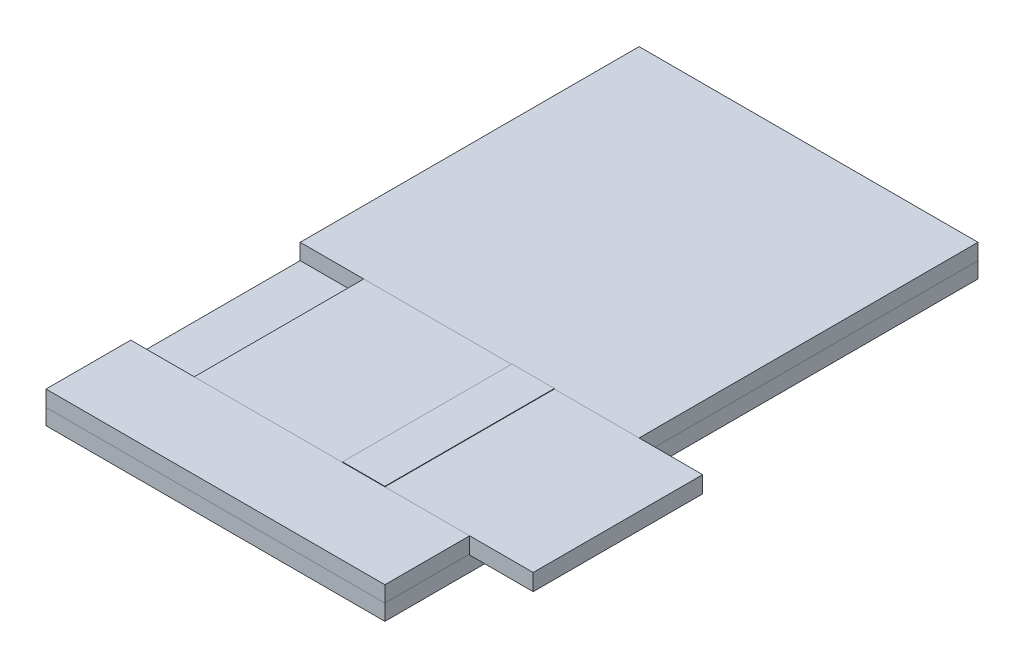
ISO-10303-21;
HEADER;
FILE_DESCRIPTION(('STEP AP214'),'2;1');
FILE_NAME('part.step','',(''),(''),'','','');
FILE_SCHEMA(('AUTOMOTIVE_DESIGN { 1 0 10303 214 1 1 1 1 }'));
ENDSEC;
DATA;
#1=APPLICATION_CONTEXT('core data for automotive mechanical design processes');
#2=APPLICATION_PROTOCOL_DEFINITION('international standard','automotive_design',2000,#1);
#3=PRODUCT_CONTEXT('',#1,'mechanical');
#4=PRODUCT('Part','Part','',(#3));
#5=PRODUCT_RELATED_PRODUCT_CATEGORY('part','',(#4));
#6=PRODUCT_DEFINITION_FORMATION('','',#4);
#7=PRODUCT_DEFINITION_CONTEXT('part definition',#1,'design');
#8=PRODUCT_DEFINITION('design','',#6,#7);
#9=PRODUCT_DEFINITION_SHAPE('','',#8);
#10=(LENGTH_UNIT() NAMED_UNIT(*) SI_UNIT(.MILLI.,.METRE.));
#11=(NAMED_UNIT(*) PLANE_ANGLE_UNIT() SI_UNIT($,.RADIAN.));
#12=(NAMED_UNIT(*) SI_UNIT($,.STERADIAN.) SOLID_ANGLE_UNIT());
#13=UNCERTAINTY_MEASURE_WITH_UNIT(LENGTH_MEASURE(1.E-05),#10,'distance_accuracy_value','');
#14=(GEOMETRIC_REPRESENTATION_CONTEXT(3) GLOBAL_UNCERTAINTY_ASSIGNED_CONTEXT((#13)) GLOBAL_UNIT_ASSIGNED_CONTEXT((#10,
#11,#12)) REPRESENTATION_CONTEXT('',''));
#15=CARTESIAN_POINT('',(0.,0.,0.));
#16=DIRECTION('',(0.,0.,1.));
#17=DIRECTION('',(1.,0.,0.));
#18=AXIS2_PLACEMENT_3D('',#15,#16,#17);
#19=CARTESIAN_POINT('',(25.4,19.35,127.));
#20=DIRECTION('',(0.,0.,-1.));
#21=DIRECTION('',(0.,1.,0.));
#22=AXIS2_PLACEMENT_3D('',#19,#20,#21);
#23=PLANE('',#22);
#24=DIRECTION('',(1.,0.,0.));
#25=VECTOR('',#24,1.);
#26=CARTESIAN_POINT('',(25.4,19.05,127.));
#27=LINE('',#26,#25);
#28=CARTESIAN_POINT('',(25.4,19.05,127.));
#29=VERTEX_POINT('',#28);
#30=CARTESIAN_POINT('',(50.8,19.05,127.));
#31=VERTEX_POINT('',#30);
#32=EDGE_CURVE('E116',#29,#31,#27,.T.);
#33=ORIENTED_EDGE('',*,*,#32,.T.);
#34=DIRECTION('',(0.,-1.,0.));
#35=VECTOR('',#34,1.);
#36=CARTESIAN_POINT('',(50.8,19.35,127.));
#37=LINE('',#36,#35);
#38=CARTESIAN_POINT('',(50.8,19.35,127.));
#39=VERTEX_POINT('',#38);
#40=EDGE_CURVE('E12',#39,#31,#37,.T.);
#41=ORIENTED_EDGE('',*,*,#40,.F.);
#42=DIRECTION('',(1.,0.,0.));
#43=VECTOR('',#42,1.);
#44=CARTESIAN_POINT('',(25.4,19.35,127.));
#45=LINE('',#44,#43);
#46=CARTESIAN_POINT('',(25.4,19.35,127.));
#47=VERTEX_POINT('',#46);
#48=EDGE_CURVE('E104',#47,#39,#45,.T.);
#49=ORIENTED_EDGE('',*,*,#48,.F.);
#50=DIRECTION('',(0.,-1.,0.));
#51=VECTOR('',#50,1.);
#52=CARTESIAN_POINT('',(25.4,19.35,127.));
#53=LINE('',#52,#51);
#54=EDGE_CURVE('E112',#47,#29,#53,.T.);
#55=ORIENTED_EDGE('',*,*,#54,.T.);
#56=EDGE_LOOP('',(#33,#41,#49,#55));
#57=FACE_BOUND('',#56,.T.);
#58=ADVANCED_FACE('F53',(#57),#23,.F.);
#59=CARTESIAN_POINT('',(50.8,19.35,127.));
#60=DIRECTION('',(-1.,0.,0.));
#61=DIRECTION('',(0.,0.,1.));
#62=AXIS2_PLACEMENT_3D('',#59,#60,#61);
#63=PLANE('',#62);
#64=DIRECTION('',(0.,0.,-1.));
#65=VECTOR('',#64,1.);
#66=CARTESIAN_POINT('',(50.8,19.05,127.));
#67=LINE('',#66,#65);
#68=CARTESIAN_POINT('',(50.8,19.05,25.4));
#69=VERTEX_POINT('',#68);
#70=EDGE_CURVE('E108',#31,#69,#67,.T.);
#71=ORIENTED_EDGE('',*,*,#70,.T.);
#72=DIRECTION('',(0.,-1.,0.));
#73=VECTOR('',#72,1.);
#74=CARTESIAN_POINT('',(50.8,19.35,25.4));
#75=LINE('',#74,#73);
#76=CARTESIAN_POINT('',(50.8,19.35,25.4));
#77=VERTEX_POINT('',#76);
#78=EDGE_CURVE('E61',#77,#69,#75,.T.);
#79=ORIENTED_EDGE('',*,*,#78,.F.);
#80=DIRECTION('',(0.,0.,-1.));
#81=VECTOR('',#80,1.);
#82=CARTESIAN_POINT('',(50.8,19.35,127.));
#83=LINE('',#82,#81);
#84=EDGE_CURVE('E99',#39,#77,#83,.T.);
#85=ORIENTED_EDGE('',*,*,#84,.F.);
#86=ORIENTED_EDGE('',*,*,#40,.T.);
#87=EDGE_LOOP('',(#71,#79,#85,#86));
#88=FACE_BOUND('',#87,.T.);
#89=ADVANCED_FACE('F107',(#88),#63,.F.);
#90=CARTESIAN_POINT('',(50.8,19.35,25.4));
#91=DIRECTION('',(0.,0.,1.));
#92=DIRECTION('',(1.,0.,0.));
#93=AXIS2_PLACEMENT_3D('',#90,#91,#92);
#94=PLANE('',#93);
#95=DIRECTION('',(-1.,0.,0.));
#96=VECTOR('',#95,1.);
#97=CARTESIAN_POINT('',(50.8,19.05,25.4));
#98=LINE('',#97,#96);
#99=CARTESIAN_POINT('',(25.4,19.05,25.4));
#100=VERTEX_POINT('',#99);
#101=EDGE_CURVE('E86',#69,#100,#98,.T.);
#102=ORIENTED_EDGE('',*,*,#101,.T.);
#103=DIRECTION('',(0.,-1.,0.));
#104=VECTOR('',#103,1.);
#105=CARTESIAN_POINT('',(25.4,19.35,25.4));
#106=LINE('',#105,#104);
#107=CARTESIAN_POINT('',(25.4,19.35,25.4));
#108=VERTEX_POINT('',#107);
#109=EDGE_CURVE('E109',#108,#100,#106,.T.);
#110=ORIENTED_EDGE('',*,*,#109,.F.);
#111=DIRECTION('',(-1.,0.,0.));
#112=VECTOR('',#111,1.);
#113=CARTESIAN_POINT('',(50.8,19.35,25.4));
#114=LINE('',#113,#112);
#115=EDGE_CURVE('E102',#77,#108,#114,.T.);
#116=ORIENTED_EDGE('',*,*,#115,.F.);
#117=ORIENTED_EDGE('',*,*,#78,.T.);
#118=EDGE_LOOP('',(#102,#110,#116,#117));
#119=FACE_BOUND('',#118,.T.);
#120=ADVANCED_FACE('F110',(#119),#94,.F.);
#121=CARTESIAN_POINT('',(25.4,19.35,25.4));
#122=DIRECTION('',(1.,0.,0.));
#123=DIRECTION('',(0.,0.,-1.));
#124=AXIS2_PLACEMENT_3D('',#121,#122,#123);
#125=PLANE('',#124);
#126=DIRECTION('',(0.,0.,1.));
#127=VECTOR('',#126,1.);
#128=CARTESIAN_POINT('',(25.4,19.05,25.4));
#129=LINE('',#128,#127);
#130=EDGE_CURVE('E92',#100,#29,#129,.T.);
#131=ORIENTED_EDGE('',*,*,#130,.T.);
#132=ORIENTED_EDGE('',*,*,#54,.F.);
#133=DIRECTION('',(0.,0.,1.));
#134=VECTOR('',#133,1.);
#135=CARTESIAN_POINT('',(25.4,19.35,25.4));
#136=LINE('',#135,#134);
#137=EDGE_CURVE('E69',#108,#47,#136,.T.);
#138=ORIENTED_EDGE('',*,*,#137,.F.);
#139=ORIENTED_EDGE('',*,*,#109,.T.);
#140=EDGE_LOOP('',(#131,#132,#138,#139));
#141=FACE_BOUND('',#140,.T.);
#142=ADVANCED_FACE('F123',(#141),#125,.F.);
#143=CARTESIAN_POINT('',(0.,19.35,0.));
#144=DIRECTION('',(0.,1.,0.));
#145=DIRECTION('',(0.,0.,1.));
#146=AXIS2_PLACEMENT_3D('',#143,#144,#145);
#147=PLANE('',#146);
#148=ORIENTED_EDGE('',*,*,#48,.T.);
#149=ORIENTED_EDGE('',*,*,#84,.T.);
#150=ORIENTED_EDGE('',*,*,#115,.T.);
#151=ORIENTED_EDGE('',*,*,#137,.T.);
#152=EDGE_LOOP('',(#148,#149,#150,#151));
#153=FACE_BOUND('',#152,.T.);
#154=ADVANCED_FACE('F100',(#153),#147,.T.);
#155=CARTESIAN_POINT('',(0.,19.05,0.));
#156=DIRECTION('',(0.,1.,0.));
#157=DIRECTION('',(0.,0.,1.));
#158=AXIS2_PLACEMENT_3D('',#155,#156,#157);
#159=PLANE('',#158);
#160=ORIENTED_EDGE('',*,*,#32,.F.);
#161=ORIENTED_EDGE('',*,*,#130,.F.);
#162=ORIENTED_EDGE('',*,*,#101,.F.);
#163=ORIENTED_EDGE('',*,*,#70,.F.);
#164=EDGE_LOOP('',(#160,#161,#162,#163));
#165=FACE_BOUND('',#164,.T.);
#166=ADVANCED_FACE('F126',(#165),#159,.F.);
#167=CLOSED_SHELL('',(#58,#89,#120,#142,#154,#166));
#168=MANIFOLD_SOLID_BREP('B2',#167);
#169=CARTESIAN_POINT('',(139.7,9.05,127.));
#170=DIRECTION('',(0.,1.,0.));
#171=DIRECTION('',(0.,0.,1.));
#172=AXIS2_PLACEMENT_3D('',#169,#170,#171);
#173=PLANE('',#172);
#174=DIRECTION('',(0.,0.,-1.));
#175=VECTOR('',#174,1.);
#176=CARTESIAN_POINT('',(-63.5,9.05,127.));
#177=LINE('',#176,#175);
#178=CARTESIAN_POINT('',(-63.5,9.05,127.));
#179=VERTEX_POINT('',#178);
#180=CARTESIAN_POINT('',(-63.5,9.05,25.4));
#181=VERTEX_POINT('',#180);
#182=EDGE_CURVE('E251',#179,#181,#177,.T.);
#183=ORIENTED_EDGE('',*,*,#182,.T.);
#184=DIRECTION('',(-1.,0.,0.));
#185=VECTOR('',#184,1.);
#186=CARTESIAN_POINT('',(139.7,9.05,25.4));
#187=LINE('',#186,#185);
#188=CARTESIAN_POINT('',(139.7,9.05,25.4));
#189=VERTEX_POINT('',#188);
#190=EDGE_CURVE('E51',#189,#181,#187,.T.);
#191=ORIENTED_EDGE('',*,*,#190,.F.);
#192=DIRECTION('',(0.,0.,-1.));
#193=VECTOR('',#192,1.);
#194=CARTESIAN_POINT('',(139.7,9.05,127.));
#195=LINE('',#194,#193);
#196=CARTESIAN_POINT('',(139.7,9.05,127.));
#197=VERTEX_POINT('',#196);
#198=EDGE_CURVE('E228',#197,#189,#195,.T.);
#199=ORIENTED_EDGE('',*,*,#198,.F.);
#200=DIRECTION('',(-1.,0.,0.));
#201=VECTOR('',#200,1.);
#202=CARTESIAN_POINT('',(139.7,9.05,127.));
#203=LINE('',#202,#201);
#204=EDGE_CURVE('E204',#197,#179,#203,.T.);
#205=ORIENTED_EDGE('',*,*,#204,.T.);
#206=EDGE_LOOP('',(#183,#191,#199,#205));
#207=FACE_BOUND('',#206,.T.);
#208=ADVANCED_FACE('F188',(#207),#173,.F.);
#209=CARTESIAN_POINT('',(139.7,19.05,25.4));
#210=DIRECTION('',(0.,0.,-1.));
#211=DIRECTION('',(-1.,0.,0.));
#212=AXIS2_PLACEMENT_3D('',#209,#210,#211);
#213=PLANE('',#212);
#214=DIRECTION('',(0.,-1.,0.));
#215=VECTOR('',#214,1.);
#216=CARTESIAN_POINT('',(-63.5,19.05,25.4));
#217=LINE('',#216,#215);
#218=CARTESIAN_POINT('',(-63.5,19.05,25.4));
#219=VERTEX_POINT('',#218);
#220=EDGE_CURVE('E237',#219,#181,#217,.T.);
#221=ORIENTED_EDGE('',*,*,#220,.F.);
#222=DIRECTION('',(-1.,0.,0.));
#223=VECTOR('',#222,1.);
#224=CARTESIAN_POINT('',(139.7,19.05,25.4));
#225=LINE('',#224,#223);
#226=CARTESIAN_POINT('',(139.7,19.05,25.4));
#227=VERTEX_POINT('',#226);
#228=EDGE_CURVE('E196',#227,#219,#225,.T.);
#229=ORIENTED_EDGE('',*,*,#228,.F.);
#230=DIRECTION('',(0.,-1.,0.));
#231=VECTOR('',#230,1.);
#232=CARTESIAN_POINT('',(139.7,19.05,25.4));
#233=LINE('',#232,#231);
#234=EDGE_CURVE('E235',#227,#189,#233,.T.);
#235=ORIENTED_EDGE('',*,*,#234,.T.);
#236=ORIENTED_EDGE('',*,*,#190,.T.);
#237=EDGE_LOOP('',(#221,#229,#235,#236));
#238=FACE_BOUND('',#237,.T.);
#239=ADVANCED_FACE('F234',(#238),#213,.T.);
#240=CARTESIAN_POINT('',(139.7,19.05,127.));
#241=DIRECTION('',(0.,1.,0.));
#242=DIRECTION('',(0.,0.,1.));
#243=AXIS2_PLACEMENT_3D('',#240,#241,#242);
#244=PLANE('',#243);
#245=DIRECTION('',(0.,0.,-1.));
#246=VECTOR('',#245,1.);
#247=CARTESIAN_POINT('',(-63.5,19.05,127.));
#248=LINE('',#247,#246);
#249=CARTESIAN_POINT('',(-63.5,19.05,127.));
#250=VERTEX_POINT('',#249);
#251=EDGE_CURVE('E254',#250,#219,#248,.T.);
#252=ORIENTED_EDGE('',*,*,#251,.F.);
#253=DIRECTION('',(-1.,0.,0.));
#254=VECTOR('',#253,1.);
#255=CARTESIAN_POINT('',(139.7,19.05,127.));
#256=LINE('',#255,#254);
#257=CARTESIAN_POINT('',(139.7,19.05,127.));
#258=VERTEX_POINT('',#257);
#259=EDGE_CURVE('E217',#258,#250,#256,.T.);
#260=ORIENTED_EDGE('',*,*,#259,.F.);
#261=DIRECTION('',(0.,0.,-1.));
#262=VECTOR('',#261,1.);
#263=CARTESIAN_POINT('',(139.7,19.05,127.));
#264=LINE('',#263,#262);
#265=EDGE_CURVE('E243',#258,#227,#264,.T.);
#266=ORIENTED_EDGE('',*,*,#265,.T.);
#267=ORIENTED_EDGE('',*,*,#228,.T.);
#268=EDGE_LOOP('',(#252,#260,#266,#267));
#269=FACE_BOUND('',#268,.T.);
#270=ADVANCED_FACE('F245',(#269),#244,.T.);
#271=CARTESIAN_POINT('',(139.7,9.05,127.));
#272=DIRECTION('',(0.,0.,1.));
#273=DIRECTION('',(1.,0.,0.));
#274=AXIS2_PLACEMENT_3D('',#271,#272,#273);
#275=PLANE('',#274);
#276=DIRECTION('',(0.,1.,0.));
#277=VECTOR('',#276,1.);
#278=CARTESIAN_POINT('',(-63.5,9.05,127.));
#279=LINE('',#278,#277);
#280=EDGE_CURVE('E256',#179,#250,#279,.T.);
#281=ORIENTED_EDGE('',*,*,#280,.F.);
#282=ORIENTED_EDGE('',*,*,#204,.F.);
#283=DIRECTION('',(0.,1.,0.));
#284=VECTOR('',#283,1.);
#285=CARTESIAN_POINT('',(139.7,9.05,127.));
#286=LINE('',#285,#284);
#287=EDGE_CURVE('E246',#197,#258,#286,.T.);
#288=ORIENTED_EDGE('',*,*,#287,.T.);
#289=ORIENTED_EDGE('',*,*,#259,.T.);
#290=EDGE_LOOP('',(#281,#282,#288,#289));
#291=FACE_BOUND('',#290,.T.);
#292=ADVANCED_FACE('F262',(#291),#275,.T.);
#293=CARTESIAN_POINT('',(139.7,0.,0.));
#294=DIRECTION('',(-1.,0.,0.));
#295=DIRECTION('',(0.,0.,1.));
#296=AXIS2_PLACEMENT_3D('',#293,#294,#295);
#297=PLANE('',#296);
#298=ORIENTED_EDGE('',*,*,#198,.T.);
#299=ORIENTED_EDGE('',*,*,#234,.F.);
#300=ORIENTED_EDGE('',*,*,#265,.F.);
#301=ORIENTED_EDGE('',*,*,#287,.F.);
#302=EDGE_LOOP('',(#298,#299,#300,#301));
#303=FACE_BOUND('',#302,.T.);
#304=ADVANCED_FACE('F242',(#303),#297,.F.);
#305=CARTESIAN_POINT('',(-63.5,0.,0.));
#306=DIRECTION('',(-1.,0.,0.));
#307=DIRECTION('',(0.,0.,1.));
#308=AXIS2_PLACEMENT_3D('',#305,#306,#307);
#309=PLANE('',#308);
#310=ORIENTED_EDGE('',*,*,#182,.F.);
#311=ORIENTED_EDGE('',*,*,#280,.T.);
#312=ORIENTED_EDGE('',*,*,#251,.T.);
#313=ORIENTED_EDGE('',*,*,#220,.T.);
#314=EDGE_LOOP('',(#310,#311,#312,#313));
#315=FACE_BOUND('',#314,.T.);
#316=ADVANCED_FACE('F261',(#315),#309,.T.);
#317=CLOSED_SHELL('',(#208,#239,#270,#292,#304,#316));
#318=MANIFOLD_SOLID_BREP('B6',#317);
#319=CARTESIAN_POINT('',(101.6,9.52500000000001,127.));
#320=DIRECTION('',(0.,-1.,0.));
#321=DIRECTION('',(0.,0.,-1.));
#322=AXIS2_PLACEMENT_3D('',#319,#320,#321);
#323=PLANE('',#322);
#324=DIRECTION('',(0.,0.,1.));
#325=VECTOR('',#324,1.);
#326=CARTESIAN_POINT('',(-101.6,9.52500000000001,127.));
#327=LINE('',#326,#325);
#328=CARTESIAN_POINT('',(-101.6,9.52500000000001,127.));
#329=VERTEX_POINT('',#328);
#330=CARTESIAN_POINT('',(-101.6,9.525,177.8));
#331=VERTEX_POINT('',#330);
#332=EDGE_CURVE('E387',#329,#331,#327,.T.);
#333=ORIENTED_EDGE('',*,*,#332,.F.);
#334=DIRECTION('',(-1.,0.,0.));
#335=VECTOR('',#334,1.);
#336=CARTESIAN_POINT('',(101.6,9.52500000000001,127.));
#337=LINE('',#336,#335);
#338=CARTESIAN_POINT('',(101.6,9.52500000000001,127.));
#339=VERTEX_POINT('',#338);
#340=EDGE_CURVE('E186',#339,#329,#337,.T.);
#341=ORIENTED_EDGE('',*,*,#340,.F.);
#342=DIRECTION('',(0.,0.,1.));
#343=VECTOR('',#342,1.);
#344=CARTESIAN_POINT('',(101.6,9.52500000000001,127.));
#345=LINE('',#344,#343);
#346=CARTESIAN_POINT('',(101.6,9.525,177.8));
#347=VERTEX_POINT('',#346);
#348=EDGE_CURVE('E381',#339,#347,#345,.T.);
#349=ORIENTED_EDGE('',*,*,#348,.T.);
#350=DIRECTION('',(-1.,0.,0.));
#351=VECTOR('',#350,1.);
#352=CARTESIAN_POINT('',(101.6,9.525,177.8));
#353=LINE('',#352,#351);
#354=EDGE_CURVE('E326',#347,#331,#353,.T.);
#355=ORIENTED_EDGE('',*,*,#354,.T.);
#356=EDGE_LOOP('',(#333,#341,#349,#355));
#357=FACE_BOUND('',#356,.T.);
#358=ADVANCED_FACE('F323',(#357),#323,.T.);
#359=CARTESIAN_POINT('',(101.6,19.05,127.));
#360=DIRECTION('',(0.,0.,-1.));
#361=DIRECTION('',(-1.,0.,0.));
#362=AXIS2_PLACEMENT_3D('',#359,#360,#361);
#363=PLANE('',#362);
#364=DIRECTION('',(0.,-1.,0.));
#365=VECTOR('',#364,1.);
#366=CARTESIAN_POINT('',(-101.6,19.05,127.));
#367=LINE('',#366,#365);
#368=CARTESIAN_POINT('',(-101.6,19.05,127.));
#369=VERTEX_POINT('',#368);
#370=EDGE_CURVE('E383',#369,#329,#367,.T.);
#371=ORIENTED_EDGE('',*,*,#370,.F.);
#372=DIRECTION('',(-1.,0.,0.));
#373=VECTOR('',#372,1.);
#374=CARTESIAN_POINT('',(101.6,19.05,127.));
#375=LINE('',#374,#373);
#376=CARTESIAN_POINT('',(101.6,19.05,127.));
#377=VERTEX_POINT('',#376);
#378=EDGE_CURVE('E332',#377,#369,#375,.T.);
#379=ORIENTED_EDGE('',*,*,#378,.F.);
#380=DIRECTION('',(0.,-1.,0.));
#381=VECTOR('',#380,1.);
#382=CARTESIAN_POINT('',(101.6,19.05,127.));
#383=LINE('',#382,#381);
#384=EDGE_CURVE('E378',#377,#339,#383,.T.);
#385=ORIENTED_EDGE('',*,*,#384,.T.);
#386=ORIENTED_EDGE('',*,*,#340,.T.);
#387=EDGE_LOOP('',(#371,#379,#385,#386));
#388=FACE_BOUND('',#387,.T.);
#389=ADVANCED_FACE('F397',(#388),#363,.T.);
#390=CARTESIAN_POINT('',(101.6,19.05,177.8));
#391=DIRECTION('',(0.,1.,0.));
#392=DIRECTION('',(0.,0.,1.));
#393=AXIS2_PLACEMENT_3D('',#390,#391,#392);
#394=PLANE('',#393);
#395=DIRECTION('',(0.,0.,-1.));
#396=VECTOR('',#395,1.);
#397=CARTESIAN_POINT('',(-101.6,19.05,177.8));
#398=LINE('',#397,#396);
#399=CARTESIAN_POINT('',(-101.6,19.05,177.8));
#400=VERTEX_POINT('',#399);
#401=EDGE_CURVE('E373',#400,#369,#398,.T.);
#402=ORIENTED_EDGE('',*,*,#401,.F.);
#403=DIRECTION('',(-1.,0.,0.));
#404=VECTOR('',#403,1.);
#405=CARTESIAN_POINT('',(101.6,19.05,177.8));
#406=LINE('',#405,#404);
#407=CARTESIAN_POINT('',(101.6,19.05,177.8));
#408=VERTEX_POINT('',#407);
#409=EDGE_CURVE('E368',#408,#400,#406,.T.);
#410=ORIENTED_EDGE('',*,*,#409,.F.);
#411=DIRECTION('',(0.,0.,-1.));
#412=VECTOR('',#411,1.);
#413=CARTESIAN_POINT('',(101.6,19.05,177.8));
#414=LINE('',#413,#412);
#415=EDGE_CURVE('E371',#408,#377,#414,.T.);
#416=ORIENTED_EDGE('',*,*,#415,.T.);
#417=ORIENTED_EDGE('',*,*,#378,.T.);
#418=EDGE_LOOP('',(#402,#410,#416,#417));
#419=FACE_BOUND('',#418,.T.);
#420=ADVANCED_FACE('F370',(#419),#394,.T.);
#421=CARTESIAN_POINT('',(101.6,9.525,177.8));
#422=DIRECTION('',(0.,0.,1.));
#423=DIRECTION('',(1.,0.,0.));
#424=AXIS2_PLACEMENT_3D('',#421,#422,#423);
#425=PLANE('',#424);
#426=DIRECTION('',(0.,1.,0.));
#427=VECTOR('',#426,1.);
#428=CARTESIAN_POINT('',(-101.6,9.525,177.8));
#429=LINE('',#428,#427);
#430=EDGE_CURVE('E390',#331,#400,#429,.T.);
#431=ORIENTED_EDGE('',*,*,#430,.F.);
#432=ORIENTED_EDGE('',*,*,#354,.F.);
#433=DIRECTION('',(0.,1.,0.));
#434=VECTOR('',#433,1.);
#435=CARTESIAN_POINT('',(101.6,9.525,177.8));
#436=LINE('',#435,#434);
#437=EDGE_CURVE('E377',#347,#408,#436,.T.);
#438=ORIENTED_EDGE('',*,*,#437,.T.);
#439=ORIENTED_EDGE('',*,*,#409,.T.);
#440=EDGE_LOOP('',(#431,#432,#438,#439));
#441=FACE_BOUND('',#440,.T.);
#442=ADVANCED_FACE('F380',(#441),#425,.T.);
#443=CARTESIAN_POINT('',(101.6,0.,0.));
#444=DIRECTION('',(-1.,0.,0.));
#445=DIRECTION('',(0.,0.,1.));
#446=AXIS2_PLACEMENT_3D('',#443,#444,#445);
#447=PLANE('',#446);
#448=ORIENTED_EDGE('',*,*,#348,.F.);
#449=ORIENTED_EDGE('',*,*,#384,.F.);
#450=ORIENTED_EDGE('',*,*,#415,.F.);
#451=ORIENTED_EDGE('',*,*,#437,.F.);
#452=EDGE_LOOP('',(#448,#449,#450,#451));
#453=FACE_BOUND('',#452,.T.);
#454=ADVANCED_FACE('F376',(#453),#447,.F.);
#455=CARTESIAN_POINT('',(-101.6,0.,0.));
#456=DIRECTION('',(-1.,0.,0.));
#457=DIRECTION('',(0.,0.,1.));
#458=AXIS2_PLACEMENT_3D('',#455,#456,#457);
#459=PLANE('',#458);
#460=ORIENTED_EDGE('',*,*,#332,.T.);
#461=ORIENTED_EDGE('',*,*,#430,.T.);
#462=ORIENTED_EDGE('',*,*,#401,.T.);
#463=ORIENTED_EDGE('',*,*,#370,.T.);
#464=EDGE_LOOP('',(#460,#461,#462,#463));
#465=FACE_BOUND('',#464,.T.);
#466=ADVANCED_FACE('F396',(#465),#459,.T.);
#467=CLOSED_SHELL('',(#358,#389,#420,#442,#454,#466));
#468=MANIFOLD_SOLID_BREP('B45',#467);
#469=CARTESIAN_POINT('',(101.6,19.05,-177.8));
#470=DIRECTION('',(0.,0.,-1.));
#471=DIRECTION('',(-1.,0.,0.));
#472=AXIS2_PLACEMENT_3D('',#469,#470,#471);
#473=PLANE('',#472);
#474=DIRECTION('',(0.,-1.,0.));
#475=VECTOR('',#474,1.);
#476=CARTESIAN_POINT('',(-101.6,19.05,-177.8));
#477=LINE('',#476,#475);
#478=CARTESIAN_POINT('',(-101.6,19.05,-177.8));
#479=VERTEX_POINT('',#478);
#480=CARTESIAN_POINT('',(-101.6,9.525,-177.8));
#481=VERTEX_POINT('',#480);
#482=EDGE_CURVE('E521',#479,#481,#477,.T.);
#483=ORIENTED_EDGE('',*,*,#482,.F.);
#484=DIRECTION('',(-1.,0.,0.));
#485=VECTOR('',#484,1.);
#486=CARTESIAN_POINT('',(101.6,19.05,-177.8));
#487=LINE('',#486,#485);
#488=CARTESIAN_POINT('',(101.6,19.05,-177.8));
#489=VERTEX_POINT('',#488);
#490=EDGE_CURVE('E321',#489,#479,#487,.T.);
#491=ORIENTED_EDGE('',*,*,#490,.F.);
#492=DIRECTION('',(0.,-1.,0.));
#493=VECTOR('',#492,1.);
#494=CARTESIAN_POINT('',(101.6,19.05,-177.8));
#495=LINE('',#494,#493);
#496=CARTESIAN_POINT('',(101.6,9.525,-177.8));
#497=VERTEX_POINT('',#496);
#498=EDGE_CURVE('E515',#489,#497,#495,.T.);
#499=ORIENTED_EDGE('',*,*,#498,.T.);
#500=DIRECTION('',(-1.,0.,0.));
#501=VECTOR('',#500,1.);
#502=CARTESIAN_POINT('',(101.6,9.525,-177.8));
#503=LINE('',#502,#501);
#504=EDGE_CURVE('E460',#497,#481,#503,.T.);
#505=ORIENTED_EDGE('',*,*,#504,.T.);
#506=EDGE_LOOP('',(#483,#491,#499,#505));
#507=FACE_BOUND('',#506,.T.);
#508=ADVANCED_FACE('F457',(#507),#473,.T.);
#509=CARTESIAN_POINT('',(101.6,19.05,25.4));
#510=DIRECTION('',(0.,1.,0.));
#511=DIRECTION('',(0.,0.,1.));
#512=AXIS2_PLACEMENT_3D('',#509,#510,#511);
#513=PLANE('',#512);
#514=DIRECTION('',(0.,0.,-1.));
#515=VECTOR('',#514,1.);
#516=CARTESIAN_POINT('',(-101.6,19.05,25.4));
#517=LINE('',#516,#515);
#518=CARTESIAN_POINT('',(-101.6,19.05,25.4));
#519=VERTEX_POINT('',#518);
#520=EDGE_CURVE('E517',#519,#479,#517,.T.);
#521=ORIENTED_EDGE('',*,*,#520,.F.);
#522=DIRECTION('',(-1.,0.,0.));
#523=VECTOR('',#522,1.);
#524=CARTESIAN_POINT('',(101.6,19.05,25.4));
#525=LINE('',#524,#523);
#526=CARTESIAN_POINT('',(101.6,19.05,25.4));
#527=VERTEX_POINT('',#526);
#528=EDGE_CURVE('E466',#527,#519,#525,.T.);
#529=ORIENTED_EDGE('',*,*,#528,.F.);
#530=DIRECTION('',(0.,0.,-1.));
#531=VECTOR('',#530,1.);
#532=CARTESIAN_POINT('',(101.6,19.05,25.4));
#533=LINE('',#532,#531);
#534=EDGE_CURVE('E512',#527,#489,#533,.T.);
#535=ORIENTED_EDGE('',*,*,#534,.T.);
#536=ORIENTED_EDGE('',*,*,#490,.T.);
#537=EDGE_LOOP('',(#521,#529,#535,#536));
#538=FACE_BOUND('',#537,.T.);
#539=ADVANCED_FACE('F531',(#538),#513,.T.);
#540=CARTESIAN_POINT('',(101.6,9.525,25.4));
#541=DIRECTION('',(0.,0.,1.));
#542=DIRECTION('',(1.,0.,0.));
#543=AXIS2_PLACEMENT_3D('',#540,#541,#542);
#544=PLANE('',#543);
#545=DIRECTION('',(0.,1.,0.));
#546=VECTOR('',#545,1.);
#547=CARTESIAN_POINT('',(-101.6,9.525,25.4));
#548=LINE('',#547,#546);
#549=CARTESIAN_POINT('',(-101.6,9.525,25.4));
#550=VERTEX_POINT('',#549);
#551=EDGE_CURVE('E507',#550,#519,#548,.T.);
#552=ORIENTED_EDGE('',*,*,#551,.F.);
#553=DIRECTION('',(-1.,0.,0.));
#554=VECTOR('',#553,1.);
#555=CARTESIAN_POINT('',(101.6,9.525,25.4));
#556=LINE('',#555,#554);
#557=CARTESIAN_POINT('',(101.6,9.525,25.4));
#558=VERTEX_POINT('',#557);
#559=EDGE_CURVE('E502',#558,#550,#556,.T.);
#560=ORIENTED_EDGE('',*,*,#559,.F.);
#561=DIRECTION('',(0.,1.,0.));
#562=VECTOR('',#561,1.);
#563=CARTESIAN_POINT('',(101.6,9.525,25.4));
#564=LINE('',#563,#562);
#565=EDGE_CURVE('E505',#558,#527,#564,.T.);
#566=ORIENTED_EDGE('',*,*,#565,.T.);
#567=ORIENTED_EDGE('',*,*,#528,.T.);
#568=EDGE_LOOP('',(#552,#560,#566,#567));
#569=FACE_BOUND('',#568,.T.);
#570=ADVANCED_FACE('F504',(#569),#544,.T.);
#571=CARTESIAN_POINT('',(101.6,9.525,-177.8));
#572=DIRECTION('',(0.,-1.,0.));
#573=DIRECTION('',(0.,0.,-1.));
#574=AXIS2_PLACEMENT_3D('',#571,#572,#573);
#575=PLANE('',#574);
#576=DIRECTION('',(0.,0.,1.));
#577=VECTOR('',#576,1.);
#578=CARTESIAN_POINT('',(-101.6,9.525,-177.8));
#579=LINE('',#578,#577);
#580=EDGE_CURVE('E524',#481,#550,#579,.T.);
#581=ORIENTED_EDGE('',*,*,#580,.F.);
#582=ORIENTED_EDGE('',*,*,#504,.F.);
#583=DIRECTION('',(0.,0.,1.));
#584=VECTOR('',#583,1.);
#585=CARTESIAN_POINT('',(101.6,9.525,-177.8));
#586=LINE('',#585,#584);
#587=EDGE_CURVE('E511',#497,#558,#586,.T.);
#588=ORIENTED_EDGE('',*,*,#587,.T.);
#589=ORIENTED_EDGE('',*,*,#559,.T.);
#590=EDGE_LOOP('',(#581,#582,#588,#589));
#591=FACE_BOUND('',#590,.T.);
#592=ADVANCED_FACE('F514',(#591),#575,.T.);
#593=CARTESIAN_POINT('',(101.6,0.,0.));
#594=DIRECTION('',(-1.,0.,0.));
#595=DIRECTION('',(0.,0.,1.));
#596=AXIS2_PLACEMENT_3D('',#593,#594,#595);
#597=PLANE('',#596);
#598=ORIENTED_EDGE('',*,*,#498,.F.);
#599=ORIENTED_EDGE('',*,*,#534,.F.);
#600=ORIENTED_EDGE('',*,*,#565,.F.);
#601=ORIENTED_EDGE('',*,*,#587,.F.);
#602=EDGE_LOOP('',(#598,#599,#600,#601));
#603=FACE_BOUND('',#602,.T.);
#604=ADVANCED_FACE('F510',(#603),#597,.F.);
#605=CARTESIAN_POINT('',(-101.6,0.,0.));
#606=DIRECTION('',(-1.,0.,0.));
#607=DIRECTION('',(0.,0.,1.));
#608=AXIS2_PLACEMENT_3D('',#605,#606,#607);
#609=PLANE('',#608);
#610=ORIENTED_EDGE('',*,*,#482,.T.);
#611=ORIENTED_EDGE('',*,*,#580,.T.);
#612=ORIENTED_EDGE('',*,*,#551,.T.);
#613=ORIENTED_EDGE('',*,*,#520,.T.);
#614=EDGE_LOOP('',(#610,#611,#612,#613));
#615=FACE_BOUND('',#614,.T.);
#616=ADVANCED_FACE('F530',(#615),#609,.T.);
#617=CLOSED_SHELL('',(#508,#539,#570,#592,#604,#616));
#618=MANIFOLD_SOLID_BREP('B180',#617);
#619=CARTESIAN_POINT('',(101.6,0.,-177.8));
#620=DIRECTION('',(0.,0.,-1.));
#621=DIRECTION('',(-1.,0.,0.));
#622=AXIS2_PLACEMENT_3D('',#619,#620,#621);
#623=PLANE('',#622);
#624=DIRECTION('',(0.,-1.,0.));
#625=VECTOR('',#624,1.);
#626=CARTESIAN_POINT('',(-101.6,0.,-177.8));
#627=LINE('',#626,#625);
#628=CARTESIAN_POINT('',(-101.6,9.525,-177.8));
#629=VERTEX_POINT('',#628);
#630=CARTESIAN_POINT('',(-101.6,0.,-177.8));
#631=VERTEX_POINT('',#630);
#632=EDGE_CURVE('E645',#629,#631,#627,.T.);
#633=ORIENTED_EDGE('',*,*,#632,.F.);
#634=DIRECTION('',(-1.,0.,0.));
#635=VECTOR('',#634,1.);
#636=CARTESIAN_POINT('',(101.6,9.525,-177.8));
#637=LINE('',#636,#635);
#638=CARTESIAN_POINT('',(101.6,9.525,-177.8));
#639=VERTEX_POINT('',#638);
#640=EDGE_CURVE('E455',#639,#629,#637,.T.);
#641=ORIENTED_EDGE('',*,*,#640,.F.);
#642=DIRECTION('',(0.,-1.,0.));
#643=VECTOR('',#642,1.);
#644=CARTESIAN_POINT('',(101.6,0.,-177.8));
#645=LINE('',#644,#643);
#646=CARTESIAN_POINT('',(101.6,0.,-177.8));
#647=VERTEX_POINT('',#646);
#648=EDGE_CURVE('E638',#639,#647,#645,.T.);
#649=ORIENTED_EDGE('',*,*,#648,.T.);
#650=DIRECTION('',(-1.,0.,0.));
#651=VECTOR('',#650,1.);
#652=CARTESIAN_POINT('',(101.6,0.,-177.8));
#653=LINE('',#652,#651);
#654=EDGE_CURVE('E620',#647,#631,#653,.T.);
#655=ORIENTED_EDGE('',*,*,#654,.T.);
#656=EDGE_LOOP('',(#633,#641,#649,#655));
#657=FACE_BOUND('',#656,.T.);
#658=ADVANCED_FACE('F582',(#657),#623,.T.);
#659=CARTESIAN_POINT('',(101.6,9.525,0.));
#660=DIRECTION('',(0.,1.,0.));
#661=DIRECTION('',(0.,0.,1.));
#662=AXIS2_PLACEMENT_3D('',#659,#660,#661);
#663=PLANE('',#662);
#664=DIRECTION('',(0.,0.,-1.));
#665=VECTOR('',#664,1.);
#666=CARTESIAN_POINT('',(-101.6,9.525,0.));
#667=LINE('',#666,#665);
#668=CARTESIAN_POINT('',(-101.6,9.525,177.8));
#669=VERTEX_POINT('',#668);
#670=EDGE_CURVE('E631',#669,#629,#667,.T.);
#671=ORIENTED_EDGE('',*,*,#670,.F.);
#672=DIRECTION('',(-1.,0.,0.));
#673=VECTOR('',#672,1.);
#674=CARTESIAN_POINT('',(101.6,9.525,177.8));
#675=LINE('',#674,#673);
#676=CARTESIAN_POINT('',(101.6,9.525,177.8));
#677=VERTEX_POINT('',#676);
#678=EDGE_CURVE('E590',#677,#669,#675,.T.);
#679=ORIENTED_EDGE('',*,*,#678,.F.);
#680=DIRECTION('',(0.,0.,-1.));
#681=VECTOR('',#680,1.);
#682=CARTESIAN_POINT('',(101.6,9.525,0.));
#683=LINE('',#682,#681);
#684=EDGE_CURVE('E629',#677,#639,#683,.T.);
#685=ORIENTED_EDGE('',*,*,#684,.T.);
#686=ORIENTED_EDGE('',*,*,#640,.T.);
#687=EDGE_LOOP('',(#671,#679,#685,#686));
#688=FACE_BOUND('',#687,.T.);
#689=ADVANCED_FACE('F628',(#688),#663,.T.);
#690=CARTESIAN_POINT('',(101.6,0.,177.8));
#691=DIRECTION('',(0.,0.,1.));
#692=DIRECTION('',(1.,0.,0.));
#693=AXIS2_PLACEMENT_3D('',#690,#691,#692);
#694=PLANE('',#693);
#695=DIRECTION('',(0.,1.,0.));
#696=VECTOR('',#695,1.);
#697=CARTESIAN_POINT('',(-101.6,0.,177.8));
#698=LINE('',#697,#696);
#699=CARTESIAN_POINT('',(-101.6,0.,177.8));
#700=VERTEX_POINT('',#699);
#701=EDGE_CURVE('E649',#700,#669,#698,.T.);
#702=ORIENTED_EDGE('',*,*,#701,.F.);
#703=DIRECTION('',(-1.,0.,0.));
#704=VECTOR('',#703,1.);
#705=CARTESIAN_POINT('',(101.6,0.,177.8));
#706=LINE('',#705,#704);
#707=CARTESIAN_POINT('',(101.6,0.,177.8));
#708=VERTEX_POINT('',#707);
#709=EDGE_CURVE('E613',#708,#700,#706,.T.);
#710=ORIENTED_EDGE('',*,*,#709,.F.);
#711=DIRECTION('',(0.,1.,0.));
#712=VECTOR('',#711,1.);
#713=CARTESIAN_POINT('',(101.6,0.,177.8));
#714=LINE('',#713,#712);
#715=EDGE_CURVE('E637',#708,#677,#714,.T.);
#716=ORIENTED_EDGE('',*,*,#715,.T.);
#717=ORIENTED_EDGE('',*,*,#678,.T.);
#718=EDGE_LOOP('',(#702,#710,#716,#717));
#719=FACE_BOUND('',#718,.T.);
#720=ADVANCED_FACE('F640',(#719),#694,.T.);
#721=CARTESIAN_POINT('',(101.6,0.,0.));
#722=DIRECTION('',(0.,1.,0.));
#723=DIRECTION('',(0.,0.,1.));
#724=AXIS2_PLACEMENT_3D('',#721,#722,#723);
#725=PLANE('',#724);
#726=DIRECTION('',(0.,0.,-1.));
#727=VECTOR('',#726,1.);
#728=CARTESIAN_POINT('',(-101.6,0.,0.));
#729=LINE('',#728,#727);
#730=EDGE_CURVE('E651',#700,#631,#729,.T.);
#731=ORIENTED_EDGE('',*,*,#730,.T.);
#732=ORIENTED_EDGE('',*,*,#654,.F.);
#733=DIRECTION('',(0.,0.,-1.));
#734=VECTOR('',#733,1.);
#735=CARTESIAN_POINT('',(101.6,0.,0.));
#736=LINE('',#735,#734);
#737=EDGE_CURVE('E598',#708,#647,#736,.T.);
#738=ORIENTED_EDGE('',*,*,#737,.F.);
#739=ORIENTED_EDGE('',*,*,#709,.T.);
#740=EDGE_LOOP('',(#731,#732,#738,#739));
#741=FACE_BOUND('',#740,.T.);
#742=ADVANCED_FACE('F661',(#741),#725,.F.);
#743=CARTESIAN_POINT('',(101.6,0.,0.));
#744=DIRECTION('',(1.,0.,0.));
#745=DIRECTION('',(0.,0.,-1.));
#746=AXIS2_PLACEMENT_3D('',#743,#744,#745);
#747=PLANE('',#746);
#748=ORIENTED_EDGE('',*,*,#648,.F.);
#749=ORIENTED_EDGE('',*,*,#684,.F.);
#750=ORIENTED_EDGE('',*,*,#715,.F.);
#751=ORIENTED_EDGE('',*,*,#737,.T.);
#752=EDGE_LOOP('',(#748,#749,#750,#751));
#753=FACE_BOUND('',#752,.T.);
#754=ADVANCED_FACE('F636',(#753),#747,.T.);
#755=CARTESIAN_POINT('',(-101.6,0.,0.));
#756=DIRECTION('',(1.,0.,0.));
#757=DIRECTION('',(0.,0.,-1.));
#758=AXIS2_PLACEMENT_3D('',#755,#756,#757);
#759=PLANE('',#758);
#760=ORIENTED_EDGE('',*,*,#632,.T.);
#761=ORIENTED_EDGE('',*,*,#730,.F.);
#762=ORIENTED_EDGE('',*,*,#701,.T.);
#763=ORIENTED_EDGE('',*,*,#670,.T.);
#764=EDGE_LOOP('',(#760,#761,#762,#763));
#765=FACE_BOUND('',#764,.T.);
#766=ADVANCED_FACE('F666',(#765),#759,.F.);
#767=CLOSED_SHELL('',(#658,#689,#720,#742,#754,#766));
#768=MANIFOLD_SOLID_BREP('B315',#767);
#769=ADVANCED_BREP_SHAPE_REPRESENTATION('',(#18,#168,#318,#468,#618,#768),#14);
#770=SHAPE_DEFINITION_REPRESENTATION(#9,#769);
ENDSEC;
END-ISO-10303-21;
